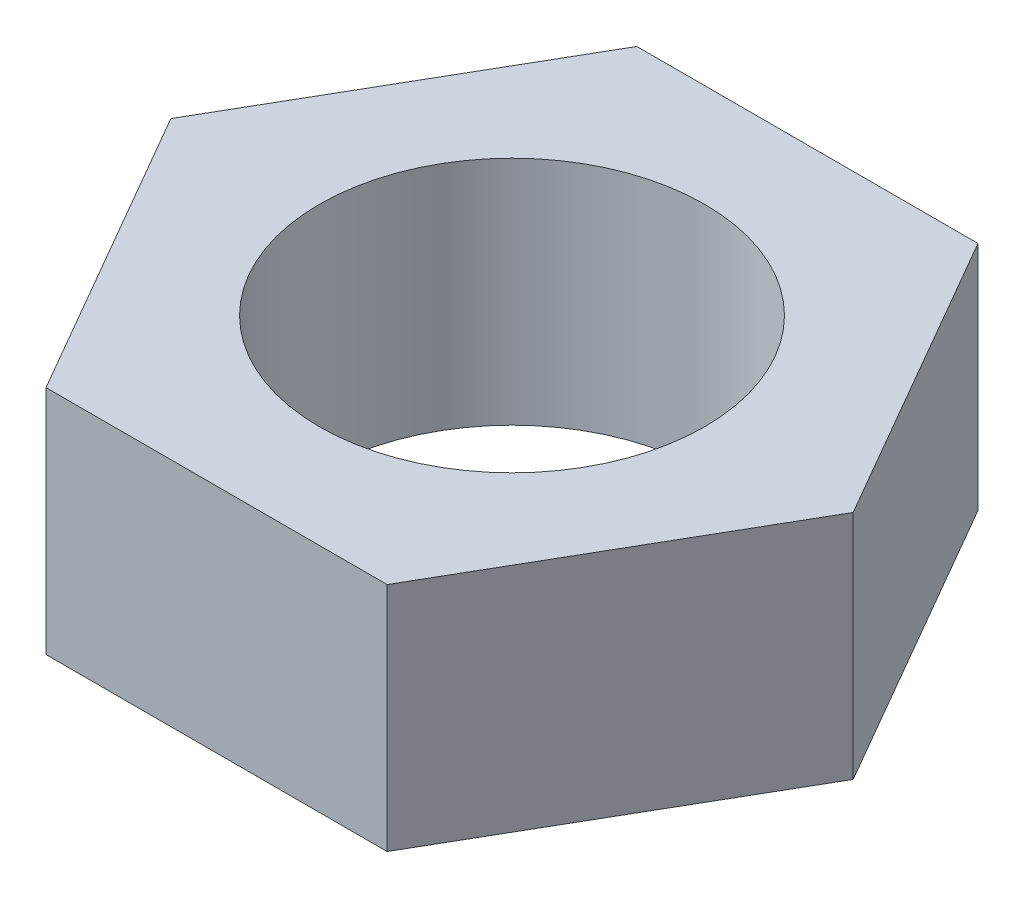
ISO-10303-21;
HEADER;
FILE_DESCRIPTION(('STEP AP214'),'2;1');
FILE_NAME('part.step','',(''),(''),'','','');
FILE_SCHEMA(('AUTOMOTIVE_DESIGN { 1 0 10303 214 1 1 1 1 }'));
ENDSEC;
DATA;
#1=APPLICATION_CONTEXT('core data for automotive mechanical design processes');
#2=APPLICATION_PROTOCOL_DEFINITION('international standard','automotive_design',2000,#1);
#3=PRODUCT_CONTEXT('',#1,'mechanical');
#4=PRODUCT('Part','Part','',(#3));
#5=PRODUCT_RELATED_PRODUCT_CATEGORY('part','',(#4));
#6=PRODUCT_DEFINITION_FORMATION('','',#4);
#7=PRODUCT_DEFINITION_CONTEXT('part definition',#1,'design');
#8=PRODUCT_DEFINITION('design','',#6,#7);
#9=PRODUCT_DEFINITION_SHAPE('','',#8);
#10=(LENGTH_UNIT() NAMED_UNIT(*) SI_UNIT(.MILLI.,.METRE.));
#11=(NAMED_UNIT(*) PLANE_ANGLE_UNIT() SI_UNIT($,.RADIAN.));
#12=(NAMED_UNIT(*) SI_UNIT($,.STERADIAN.) SOLID_ANGLE_UNIT());
#13=UNCERTAINTY_MEASURE_WITH_UNIT(LENGTH_MEASURE(1.E-05),#10,'distance_accuracy_value','');
#14=(GEOMETRIC_REPRESENTATION_CONTEXT(3) GLOBAL_UNCERTAINTY_ASSIGNED_CONTEXT((#13)) GLOBAL_UNIT_ASSIGNED_CONTEXT((#10,
#11,#12)) REPRESENTATION_CONTEXT('',''));
#15=CARTESIAN_POINT('',(0.,0.,0.));
#16=DIRECTION('',(0.,0.,1.));
#17=DIRECTION('',(1.,0.,0.));
#18=AXIS2_PLACEMENT_3D('',#15,#16,#17);
#19=CARTESIAN_POINT('',(0.,11.43,0.));
#20=DIRECTION('',(0.,1.,0.));
#21=DIRECTION('',(0.,0.,1.));
#22=AXIS2_PLACEMENT_3D('',#19,#20,#21);
#23=PLANE('',#22);
#24=DIRECTION('',(0.5,0.,-0.866025403784439));
#25=VECTOR('',#24,1.);
#26=CARTESIAN_POINT('',(8.43220068151448,11.43,14.605));
#27=LINE('',#26,#25);
#28=CARTESIAN_POINT('',(8.43220068151448,11.43,14.605));
#29=VERTEX_POINT('',#28);
#30=CARTESIAN_POINT('',(16.864401363029,11.43,0.));
#31=VERTEX_POINT('',#30);
#32=EDGE_CURVE('E133',#29,#31,#27,.T.);
#33=ORIENTED_EDGE('',*,*,#32,.T.);
#34=DIRECTION('',(-0.5,0.,-0.866025403784439));
#35=VECTOR('',#34,1.);
#36=CARTESIAN_POINT('',(16.864401363029,11.43,0.));
#37=LINE('',#36,#35);
#38=CARTESIAN_POINT('',(8.43220068151447,11.43,-14.605));
#39=VERTEX_POINT('',#38);
#40=EDGE_CURVE('E91',#31,#39,#37,.T.);
#41=ORIENTED_EDGE('',*,*,#40,.T.);
#42=DIRECTION('',(-1.,0.,0.));
#43=VECTOR('',#42,1.);
#44=CARTESIAN_POINT('',(8.43220068151447,11.43,-14.605));
#45=LINE('',#44,#43);
#46=CARTESIAN_POINT('',(-8.43220068151448,11.43,-14.605));
#47=VERTEX_POINT('',#46);
#48=EDGE_CURVE('E104',#39,#47,#45,.T.);
#49=ORIENTED_EDGE('',*,*,#48,.T.);
#50=DIRECTION('',(-0.5,0.,0.866025403784439));
#51=VECTOR('',#50,1.);
#52=CARTESIAN_POINT('',(-8.43220068151448,11.43,-14.605));
#53=LINE('',#52,#51);
#54=CARTESIAN_POINT('',(-16.864401363029,11.43,0.));
#55=VERTEX_POINT('',#54);
#56=EDGE_CURVE('E98',#47,#55,#53,.T.);
#57=ORIENTED_EDGE('',*,*,#56,.T.);
#58=DIRECTION('',(0.5,0.,0.866025403784439));
#59=VECTOR('',#58,1.);
#60=CARTESIAN_POINT('',(-16.864401363029,11.43,0.));
#61=LINE('',#60,#59);
#62=CARTESIAN_POINT('',(-8.43220068151447,11.43,14.605));
#63=VERTEX_POINT('',#62);
#64=EDGE_CURVE('E102',#55,#63,#61,.T.);
#65=ORIENTED_EDGE('',*,*,#64,.T.);
#66=DIRECTION('',(1.,0.,0.));
#67=VECTOR('',#66,1.);
#68=CARTESIAN_POINT('',(-8.43220068151447,11.43,14.605));
#69=LINE('',#68,#67);
#70=EDGE_CURVE('E54',#63,#29,#69,.T.);
#71=ORIENTED_EDGE('',*,*,#70,.T.);
#72=EDGE_LOOP('',(#33,#41,#49,#57,#65,#71));
#73=FACE_BOUND('',#72,.T.);
#74=CARTESIAN_POINT('',(0.,11.43,0.));
#75=DIRECTION('',(0.,1.,0.));
#76=DIRECTION('',(0.,0.,1.));
#77=AXIS2_PLACEMENT_3D('',#74,#75,#76);
#78=CIRCLE('',#77,9.525);
#79=CARTESIAN_POINT('',(0.,11.43,9.525));
#80=VERTEX_POINT('',#79);
#81=EDGE_CURVE('E126',#80,#80,#78,.T.);
#82=ORIENTED_EDGE('',*,*,#81,.F.);
#83=EDGE_LOOP('',(#82));
#84=FACE_BOUND('',#83,.T.);
#85=ADVANCED_FACE('F37',(#73,#84),#23,.T.);
#86=CARTESIAN_POINT('',(0.,0.,0.));
#87=DIRECTION('',(0.,1.,0.));
#88=DIRECTION('',(0.,0.,1.));
#89=AXIS2_PLACEMENT_3D('',#86,#87,#88);
#90=PLANE('',#89);
#91=DIRECTION('',(0.5,0.,-0.866025403784439));
#92=VECTOR('',#91,1.);
#93=CARTESIAN_POINT('',(8.43220068151448,0.,14.605));
#94=LINE('',#93,#92);
#95=CARTESIAN_POINT('',(8.43220068151448,0.,14.605));
#96=VERTEX_POINT('',#95);
#97=CARTESIAN_POINT('',(16.864401363029,0.,0.));
#98=VERTEX_POINT('',#97);
#99=EDGE_CURVE('E122',#96,#98,#94,.T.);
#100=ORIENTED_EDGE('',*,*,#99,.F.);
#101=DIRECTION('',(1.,0.,0.));
#102=VECTOR('',#101,1.);
#103=CARTESIAN_POINT('',(-8.43220068151447,0.,14.605));
#104=LINE('',#103,#102);
#105=CARTESIAN_POINT('',(-8.43220068151447,0.,14.605));
#106=VERTEX_POINT('',#105);
#107=EDGE_CURVE('E83',#106,#96,#104,.T.);
#108=ORIENTED_EDGE('',*,*,#107,.F.);
#109=DIRECTION('',(0.5,0.,0.866025403784439));
#110=VECTOR('',#109,1.);
#111=CARTESIAN_POINT('',(-16.864401363029,0.,0.));
#112=LINE('',#111,#110);
#113=CARTESIAN_POINT('',(-16.864401363029,0.,0.));
#114=VERTEX_POINT('',#113);
#115=EDGE_CURVE('E77',#114,#106,#112,.T.);
#116=ORIENTED_EDGE('',*,*,#115,.F.);
#117=DIRECTION('',(-0.5,0.,0.866025403784439));
#118=VECTOR('',#117,1.);
#119=CARTESIAN_POINT('',(-8.43220068151448,0.,-14.605));
#120=LINE('',#119,#118);
#121=CARTESIAN_POINT('',(-8.43220068151448,0.,-14.605));
#122=VERTEX_POINT('',#121);
#123=EDGE_CURVE('E112',#122,#114,#120,.T.);
#124=ORIENTED_EDGE('',*,*,#123,.F.);
#125=DIRECTION('',(-1.,0.,0.));
#126=VECTOR('',#125,1.);
#127=CARTESIAN_POINT('',(8.43220068151447,0.,-14.605));
#128=LINE('',#127,#126);
#129=CARTESIAN_POINT('',(8.43220068151447,0.,-14.605));
#130=VERTEX_POINT('',#129);
#131=EDGE_CURVE('E128',#130,#122,#128,.T.);
#132=ORIENTED_EDGE('',*,*,#131,.F.);
#133=DIRECTION('',(-0.5,0.,-0.866025403784439));
#134=VECTOR('',#133,1.);
#135=CARTESIAN_POINT('',(16.864401363029,0.,0.));
#136=LINE('',#135,#134);
#137=EDGE_CURVE('E125',#98,#130,#136,.T.);
#138=ORIENTED_EDGE('',*,*,#137,.F.);
#139=EDGE_LOOP('',(#100,#108,#116,#124,#132,#138));
#140=FACE_BOUND('',#139,.T.);
#141=CARTESIAN_POINT('',(0.,0.,0.));
#142=DIRECTION('',(0.,1.,0.));
#143=DIRECTION('',(0.,0.,1.));
#144=AXIS2_PLACEMENT_3D('',#141,#142,#143);
#145=CIRCLE('',#144,9.525);
#146=CARTESIAN_POINT('',(0.,0.,9.525));
#147=VERTEX_POINT('',#146);
#148=EDGE_CURVE('E244',#147,#147,#145,.T.);
#149=ORIENTED_EDGE('',*,*,#148,.T.);
#150=EDGE_LOOP('',(#149));
#151=FACE_BOUND('',#150,.T.);
#152=ADVANCED_FACE('F142',(#140,#151),#90,.F.);
#153=CARTESIAN_POINT('',(8.43220068151448,11.43,14.605));
#154=DIRECTION('',(-0.866025403784439,0.,-0.5));
#155=DIRECTION('',(-0.5,0.,0.866025403784439));
#156=AXIS2_PLACEMENT_3D('',#153,#154,#155);
#157=PLANE('',#156);
#158=ORIENTED_EDGE('',*,*,#99,.T.);
#159=DIRECTION('',(0.,-1.,0.));
#160=VECTOR('',#159,1.);
#161=CARTESIAN_POINT('',(16.864401363029,11.43,0.));
#162=LINE('',#161,#160);
#163=EDGE_CURVE('E11',#31,#98,#162,.T.);
#164=ORIENTED_EDGE('',*,*,#163,.F.);
#165=ORIENTED_EDGE('',*,*,#32,.F.);
#166=DIRECTION('',(0.,-1.,0.));
#167=VECTOR('',#166,1.);
#168=CARTESIAN_POINT('',(8.43220068151448,11.43,14.605));
#169=LINE('',#168,#167);
#170=EDGE_CURVE('E118',#29,#96,#169,.T.);
#171=ORIENTED_EDGE('',*,*,#170,.T.);
#172=EDGE_LOOP('',(#158,#164,#165,#171));
#173=FACE_BOUND('',#172,.T.);
#174=ADVANCED_FACE('F39',(#173),#157,.F.);
#175=CARTESIAN_POINT('',(16.864401363029,11.43,0.));
#176=DIRECTION('',(-0.866025403784439,0.,0.5));
#177=DIRECTION('',(0.5,0.,0.866025403784439));
#178=AXIS2_PLACEMENT_3D('',#175,#176,#177);
#179=PLANE('',#178);
#180=ORIENTED_EDGE('',*,*,#137,.T.);
#181=DIRECTION('',(0.,-1.,0.));
#182=VECTOR('',#181,1.);
#183=CARTESIAN_POINT('',(8.43220068151447,11.43,-14.605));
#184=LINE('',#183,#182);
#185=EDGE_CURVE('E46',#39,#130,#184,.T.);
#186=ORIENTED_EDGE('',*,*,#185,.F.);
#187=ORIENTED_EDGE('',*,*,#40,.F.);
#188=ORIENTED_EDGE('',*,*,#163,.T.);
#189=EDGE_LOOP('',(#180,#186,#187,#188));
#190=FACE_BOUND('',#189,.T.);
#191=ADVANCED_FACE('F167',(#190),#179,.F.);
#192=CARTESIAN_POINT('',(8.43220068151447,11.43,-14.605));
#193=DIRECTION('',(0.,0.,1.));
#194=DIRECTION('',(1.,0.,0.));
#195=AXIS2_PLACEMENT_3D('',#192,#193,#194);
#196=PLANE('',#195);
#197=ORIENTED_EDGE('',*,*,#131,.T.);
#198=DIRECTION('',(0.,-1.,0.));
#199=VECTOR('',#198,1.);
#200=CARTESIAN_POINT('',(-8.43220068151448,11.43,-14.605));
#201=LINE('',#200,#199);
#202=EDGE_CURVE('E113',#47,#122,#201,.T.);
#203=ORIENTED_EDGE('',*,*,#202,.F.);
#204=ORIENTED_EDGE('',*,*,#48,.F.);
#205=ORIENTED_EDGE('',*,*,#185,.T.);
#206=EDGE_LOOP('',(#197,#203,#204,#205));
#207=FACE_BOUND('',#206,.T.);
#208=ADVANCED_FACE('F139',(#207),#196,.F.);
#209=CARTESIAN_POINT('',(-8.43220068151448,11.43,-14.605));
#210=DIRECTION('',(0.866025403784439,0.,0.5));
#211=DIRECTION('',(0.5,0.,-0.866025403784439));
#212=AXIS2_PLACEMENT_3D('',#209,#210,#211);
#213=PLANE('',#212);
#214=ORIENTED_EDGE('',*,*,#123,.T.);
#215=DIRECTION('',(0.,-1.,0.));
#216=VECTOR('',#215,1.);
#217=CARTESIAN_POINT('',(-16.864401363029,11.43,0.));
#218=LINE('',#217,#216);
#219=EDGE_CURVE('E109',#55,#114,#218,.T.);
#220=ORIENTED_EDGE('',*,*,#219,.F.);
#221=ORIENTED_EDGE('',*,*,#56,.F.);
#222=ORIENTED_EDGE('',*,*,#202,.T.);
#223=EDGE_LOOP('',(#214,#220,#221,#222));
#224=FACE_BOUND('',#223,.T.);
#225=ADVANCED_FACE('F110',(#224),#213,.F.);
#226=CARTESIAN_POINT('',(-16.864401363029,11.43,0.));
#227=DIRECTION('',(0.866025403784439,0.,-0.5));
#228=DIRECTION('',(-0.5,0.,-0.866025403784439));
#229=AXIS2_PLACEMENT_3D('',#226,#227,#228);
#230=PLANE('',#229);
#231=ORIENTED_EDGE('',*,*,#115,.T.);
#232=DIRECTION('',(0.,-1.,0.));
#233=VECTOR('',#232,1.);
#234=CARTESIAN_POINT('',(-8.43220068151447,11.43,14.605));
#235=LINE('',#234,#233);
#236=EDGE_CURVE('E114',#63,#106,#235,.T.);
#237=ORIENTED_EDGE('',*,*,#236,.F.);
#238=ORIENTED_EDGE('',*,*,#64,.F.);
#239=ORIENTED_EDGE('',*,*,#219,.T.);
#240=EDGE_LOOP('',(#231,#237,#238,#239));
#241=FACE_BOUND('',#240,.T.);
#242=ADVANCED_FACE('F116',(#241),#230,.F.);
#243=CARTESIAN_POINT('',(-8.43220068151447,11.43,14.605));
#244=DIRECTION('',(0.,0.,-1.));
#245=DIRECTION('',(-1.,0.,0.));
#246=AXIS2_PLACEMENT_3D('',#243,#244,#245);
#247=PLANE('',#246);
#248=ORIENTED_EDGE('',*,*,#107,.T.);
#249=ORIENTED_EDGE('',*,*,#170,.F.);
#250=ORIENTED_EDGE('',*,*,#70,.F.);
#251=ORIENTED_EDGE('',*,*,#236,.T.);
#252=EDGE_LOOP('',(#248,#249,#250,#251));
#253=FACE_BOUND('',#252,.T.);
#254=ADVANCED_FACE('F147',(#253),#247,.F.);
#255=CARTESIAN_POINT('',(0.,11.43,0.));
#256=DIRECTION('',(0.,-1.,0.));
#257=DIRECTION('',(0.,0.,-1.));
#258=AXIS2_PLACEMENT_3D('',#255,#256,#257);
#259=CYLINDRICAL_SURFACE('',#258,9.525);
#260=ORIENTED_EDGE('',*,*,#81,.T.);
#261=EDGE_LOOP('',(#260));
#262=FACE_BOUND('',#261,.T.);
#263=ORIENTED_EDGE('',*,*,#148,.F.);
#264=EDGE_LOOP('',(#263));
#265=FACE_BOUND('',#264,.T.);
#266=ADVANCED_FACE('F149',(#262,#265),#259,.F.);
#267=CLOSED_SHELL('',(#85,#152,#174,#191,#208,#225,#242,#254,#266));
#268=MANIFOLD_SOLID_BREP('B2',#267);
#269=ADVANCED_BREP_SHAPE_REPRESENTATION('',(#18,#268),#14);
#270=SHAPE_DEFINITION_REPRESENTATION(#9,#269);
ENDSEC;
END-ISO-10303-21;
